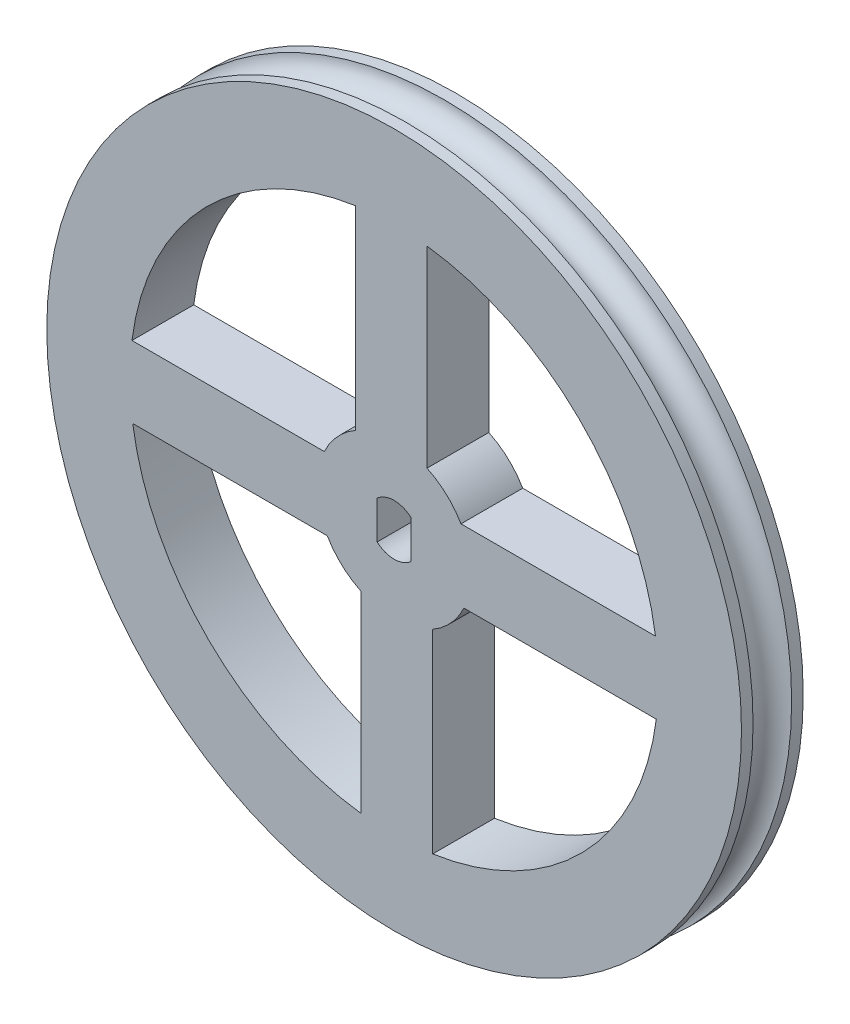
ISO-10303-21;
HEADER;
FILE_DESCRIPTION(('STEP AP214'),'2;1');
FILE_NAME('part.step','',(''),(''),'','','');
FILE_SCHEMA(('AUTOMOTIVE_DESIGN { 1 0 10303 214 1 1 1 1 }'));
ENDSEC;
DATA;
#1=APPLICATION_CONTEXT('core data for automotive mechanical design processes');
#2=APPLICATION_PROTOCOL_DEFINITION('international standard','automotive_design',2000,#1);
#3=PRODUCT_CONTEXT('',#1,'mechanical');
#4=PRODUCT('Part','Part','',(#3));
#5=PRODUCT_RELATED_PRODUCT_CATEGORY('part','',(#4));
#6=PRODUCT_DEFINITION_FORMATION('','',#4);
#7=PRODUCT_DEFINITION_CONTEXT('part definition',#1,'design');
#8=PRODUCT_DEFINITION('design','',#6,#7);
#9=PRODUCT_DEFINITION_SHAPE('','',#8);
#10=(LENGTH_UNIT() NAMED_UNIT(*) SI_UNIT(.MILLI.,.METRE.));
#11=(NAMED_UNIT(*) PLANE_ANGLE_UNIT() SI_UNIT($,.RADIAN.));
#12=(NAMED_UNIT(*) SI_UNIT($,.STERADIAN.) SOLID_ANGLE_UNIT());
#13=UNCERTAINTY_MEASURE_WITH_UNIT(LENGTH_MEASURE(1.E-05),#10,'distance_accuracy_value','');
#14=(GEOMETRIC_REPRESENTATION_CONTEXT(3) GLOBAL_UNCERTAINTY_ASSIGNED_CONTEXT((#13)) GLOBAL_UNIT_ASSIGNED_CONTEXT((#10,
#11,#12)) REPRESENTATION_CONTEXT('',''));
#15=CARTESIAN_POINT('',(0.,0.,0.));
#16=DIRECTION('',(0.,0.,1.));
#17=DIRECTION('',(1.,0.,0.));
#18=AXIS2_PLACEMENT_3D('',#15,#16,#17);
#19=CARTESIAN_POINT('',(0.,0.,10.16));
#20=DIRECTION('',(0.,0.,1.));
#21=DIRECTION('',(1.,0.,0.));
#22=AXIS2_PLACEMENT_3D('',#19,#20,#21);
#23=PLANE('',#22);
#24=CARTESIAN_POINT('',(0.,0.,10.16));
#25=DIRECTION('',(0.,0.,-1.));
#26=DIRECTION('',(-1.,0.,0.));
#27=AXIS2_PLACEMENT_3D('',#24,#25,#26);
#28=CIRCLE('',#27,4.191);
#29=CARTESIAN_POINT('',(-2.794,3.12378696456721,10.16));
#30=VERTEX_POINT('',#29);
#31=CARTESIAN_POINT('',(2.794,3.12378696456721,10.16));
#32=VERTEX_POINT('',#31);
#33=EDGE_CURVE('E179',#30,#32,#28,.T.);
#34=ORIENTED_EDGE('',*,*,#33,.T.);
#35=DIRECTION('',(0.,-1.,0.));
#36=VECTOR('',#35,1.);
#37=CARTESIAN_POINT('',(2.794,3.12378696456721,10.16));
#38=LINE('',#37,#36);
#39=CARTESIAN_POINT('',(2.794,-3.12378696456721,10.16));
#40=VERTEX_POINT('',#39);
#41=EDGE_CURVE('E188',#32,#40,#38,.T.);
#42=ORIENTED_EDGE('',*,*,#41,.T.);
#43=CARTESIAN_POINT('',(0.,0.,10.16));
#44=DIRECTION('',(0.,0.,-1.));
#45=DIRECTION('',(-1.,0.,0.));
#46=AXIS2_PLACEMENT_3D('',#43,#44,#45);
#47=CIRCLE('',#46,4.191);
#48=CARTESIAN_POINT('',(-2.794,-3.12378696456721,10.16));
#49=VERTEX_POINT('',#48);
#50=EDGE_CURVE('E55',#40,#49,#47,.T.);
#51=ORIENTED_EDGE('',*,*,#50,.T.);
#52=DIRECTION('',(0.,1.,0.));
#53=VECTOR('',#52,1.);
#54=CARTESIAN_POINT('',(-2.794,3.12378696456721,10.16));
#55=LINE('',#54,#53);
#56=EDGE_CURVE('E185',#49,#30,#55,.T.);
#57=ORIENTED_EDGE('',*,*,#56,.T.);
#58=EDGE_LOOP('',(#34,#42,#51,#57));
#59=FACE_BOUND('',#58,.T.);
#60=CARTESIAN_POINT('',(0.,0.,10.16));
#61=DIRECTION('',(0.,0.,-1.));
#62=DIRECTION('',(1.,0.,0.));
#63=AXIS2_PLACEMENT_3D('',#60,#61,#62);
#64=CIRCLE('',#63,43.4704101415283);
#65=CARTESIAN_POINT('',(5.41057402840431,43.1323804879333,10.16));
#66=VERTEX_POINT('',#65);
#67=CARTESIAN_POINT('',(43.0041167549421,6.35,10.16));
#68=VERTEX_POINT('',#67);
#69=EDGE_CURVE('E292',#66,#68,#64,.T.);
#70=ORIENTED_EDGE('',*,*,#69,.T.);
#71=DIRECTION('',(-1.,0.,0.));
#72=VECTOR('',#71,1.);
#73=CARTESIAN_POINT('',(43.0041167549421,6.35,10.16));
#74=LINE('',#73,#72);
#75=CARTESIAN_POINT('',(10.9985226280624,6.35,10.16));
#76=VERTEX_POINT('',#75);
#77=EDGE_CURVE('E304',#68,#76,#74,.T.);
#78=ORIENTED_EDGE('',*,*,#77,.T.);
#79=CARTESIAN_POINT('',(0.,0.,10.16));
#80=DIRECTION('',(0.,0.,1.));
#81=DIRECTION('',(1.,0.,0.));
#82=AXIS2_PLACEMENT_3D('',#79,#80,#81);
#83=CIRCLE('',#82,12.7);
#84=CARTESIAN_POINT('',(5.4105740284043,11.4898080350873,10.16));
#85=VERTEX_POINT('',#84);
#86=EDGE_CURVE('E301',#76,#85,#83,.T.);
#87=ORIENTED_EDGE('',*,*,#86,.T.);
#88=DIRECTION('',(0.,1.,0.));
#89=VECTOR('',#88,1.);
#90=CARTESIAN_POINT('',(5.4105740284043,11.4898080350873,10.16));
#91=LINE('',#90,#89);
#92=EDGE_CURVE('E282',#85,#66,#91,.T.);
#93=ORIENTED_EDGE('',*,*,#92,.T.);
#94=EDGE_LOOP('',(#70,#78,#87,#93));
#95=FACE_BOUND('',#94,.T.);
#96=CARTESIAN_POINT('',(0.,0.,10.16));
#97=DIRECTION('',(0.,0.,-1.));
#98=DIRECTION('',(1.,0.,0.));
#99=AXIS2_PLACEMENT_3D('',#96,#97,#98);
#100=CIRCLE('',#99,43.4704101415283);
#101=CARTESIAN_POINT('',(43.1323804879333,-5.41057402840431,10.16));
#102=VERTEX_POINT('',#101);
#103=CARTESIAN_POINT('',(6.35,-43.0041167549421,10.16));
#104=VERTEX_POINT('',#103);
#105=EDGE_CURVE('E262',#102,#104,#100,.T.);
#106=ORIENTED_EDGE('',*,*,#105,.T.);
#107=DIRECTION('',(0.,1.,0.));
#108=VECTOR('',#107,1.);
#109=CARTESIAN_POINT('',(6.35,-43.0041167549421,10.16));
#110=LINE('',#109,#108);
#111=CARTESIAN_POINT('',(6.35,-10.9985226280624,10.16));
#112=VERTEX_POINT('',#111);
#113=EDGE_CURVE('E274',#104,#112,#110,.T.);
#114=ORIENTED_EDGE('',*,*,#113,.T.);
#115=CARTESIAN_POINT('',(0.,0.,10.16));
#116=DIRECTION('',(0.,0.,1.));
#117=DIRECTION('',(1.,0.,0.));
#118=AXIS2_PLACEMENT_3D('',#115,#116,#117);
#119=CIRCLE('',#118,12.7);
#120=CARTESIAN_POINT('',(11.4898080350873,-5.4105740284043,10.16));
#121=VERTEX_POINT('',#120);
#122=EDGE_CURVE('E271',#112,#121,#119,.T.);
#123=ORIENTED_EDGE('',*,*,#122,.T.);
#124=DIRECTION('',(1.,0.,0.));
#125=VECTOR('',#124,1.);
#126=CARTESIAN_POINT('',(11.4898080350873,-5.4105740284043,10.16));
#127=LINE('',#126,#125);
#128=EDGE_CURVE('E250',#121,#102,#127,.T.);
#129=ORIENTED_EDGE('',*,*,#128,.T.);
#130=EDGE_LOOP('',(#106,#114,#123,#129));
#131=FACE_BOUND('',#130,.T.);
#132=CARTESIAN_POINT('',(0.,0.,10.16));
#133=DIRECTION('',(0.,0.,-1.));
#134=DIRECTION('',(1.,0.,0.));
#135=AXIS2_PLACEMENT_3D('',#132,#133,#134);
#136=CIRCLE('',#135,43.4704101415283);
#137=CARTESIAN_POINT('',(-5.41057402840431,-43.1323804879333,10.16));
#138=VERTEX_POINT('',#137);
#139=CARTESIAN_POINT('',(-43.0041167549421,-6.35,10.16));
#140=VERTEX_POINT('',#139);
#141=EDGE_CURVE('E228',#138,#140,#136,.T.);
#142=ORIENTED_EDGE('',*,*,#141,.T.);
#143=DIRECTION('',(1.,0.,0.));
#144=VECTOR('',#143,1.);
#145=CARTESIAN_POINT('',(-43.0041167549421,-6.35,10.16));
#146=LINE('',#145,#144);
#147=CARTESIAN_POINT('',(-10.9985226280624,-6.35,10.16));
#148=VERTEX_POINT('',#147);
#149=EDGE_CURVE('E242',#140,#148,#146,.T.);
#150=ORIENTED_EDGE('',*,*,#149,.T.);
#151=CARTESIAN_POINT('',(0.,0.,10.16));
#152=DIRECTION('',(0.,0.,1.));
#153=DIRECTION('',(1.,0.,0.));
#154=AXIS2_PLACEMENT_3D('',#151,#152,#153);
#155=CIRCLE('',#154,12.7);
#156=CARTESIAN_POINT('',(-5.4105740284043,-11.4898080350873,10.16));
#157=VERTEX_POINT('',#156);
#158=EDGE_CURVE('E239',#148,#157,#155,.T.);
#159=ORIENTED_EDGE('',*,*,#158,.T.);
#160=DIRECTION('',(0.,-1.,0.));
#161=VECTOR('',#160,1.);
#162=CARTESIAN_POINT('',(-5.4105740284043,-11.4898080350873,10.16));
#163=LINE('',#162,#161);
#164=EDGE_CURVE('E216',#157,#138,#163,.T.);
#165=ORIENTED_EDGE('',*,*,#164,.T.);
#166=EDGE_LOOP('',(#142,#150,#159,#165));
#167=FACE_BOUND('',#166,.T.);
#168=CARTESIAN_POINT('',(0.,0.,10.16));
#169=DIRECTION('',(0.,0.,-1.));
#170=DIRECTION('',(1.,0.,0.));
#171=AXIS2_PLACEMENT_3D('',#168,#169,#170);
#172=CIRCLE('',#171,43.4704101415283);
#173=CARTESIAN_POINT('',(-43.1323804879333,5.41057402840431,10.16));
#174=VERTEX_POINT('',#173);
#175=CARTESIAN_POINT('',(-6.35,43.0041167549421,10.16));
#176=VERTEX_POINT('',#175);
#177=EDGE_CURVE('E309',#174,#176,#172,.T.);
#178=ORIENTED_EDGE('',*,*,#177,.T.);
#179=DIRECTION('',(0.,-1.,0.));
#180=VECTOR('',#179,1.);
#181=CARTESIAN_POINT('',(-6.35,43.0041167549421,10.16));
#182=LINE('',#181,#180);
#183=CARTESIAN_POINT('',(-6.35,10.9985226280624,10.16));
#184=VERTEX_POINT('',#183);
#185=EDGE_CURVE('E312',#176,#184,#182,.T.);
#186=ORIENTED_EDGE('',*,*,#185,.T.);
#187=CARTESIAN_POINT('',(0.,0.,10.16));
#188=DIRECTION('',(0.,0.,1.));
#189=DIRECTION('',(1.,0.,0.));
#190=AXIS2_PLACEMENT_3D('',#187,#188,#189);
#191=CIRCLE('',#190,12.7);
#192=CARTESIAN_POINT('',(-11.4898080350873,5.4105740284043,10.16));
#193=VERTEX_POINT('',#192);
#194=EDGE_CURVE('E316',#184,#193,#191,.T.);
#195=ORIENTED_EDGE('',*,*,#194,.T.);
#196=DIRECTION('',(-1.,0.,0.));
#197=VECTOR('',#196,1.);
#198=CARTESIAN_POINT('',(-11.4898080350873,5.4105740284043,10.16));
#199=LINE('',#198,#197);
#200=EDGE_CURVE('E319',#193,#174,#199,.T.);
#201=ORIENTED_EDGE('',*,*,#200,.T.);
#202=EDGE_LOOP('',(#178,#186,#195,#201));
#203=FACE_BOUND('',#202,.T.);
#204=CARTESIAN_POINT('',(0.,0.,10.16));
#205=DIRECTION('',(0.,0.,-1.));
#206=DIRECTION('',(-1.,0.,0.));
#207=AXIS2_PLACEMENT_3D('',#204,#205,#206);
#208=CIRCLE('',#207,57.15);
#209=CARTESIAN_POINT('',(-57.15,0.,10.16));
#210=VERTEX_POINT('',#209);
#211=EDGE_CURVE('E11',#210,#210,#208,.T.);
#212=ORIENTED_EDGE('',*,*,#211,.F.);
#213=EDGE_LOOP('',(#212));
#214=FACE_BOUND('',#213,.T.);
#215=ADVANCED_FACE('F41',(#59,#95,#131,#167,#203,#214),#23,.T.);
#216=CARTESIAN_POINT('',(0.,0.,0.));
#217=DIRECTION('',(0.,0.,-1.));
#218=DIRECTION('',(-1.,0.,0.));
#219=AXIS2_PLACEMENT_3D('',#216,#217,#218);
#220=CYLINDRICAL_SURFACE('',#219,57.15);
#221=ORIENTED_EDGE('',*,*,#211,.T.);
#222=EDGE_LOOP('',(#221));
#223=FACE_BOUND('',#222,.T.);
#224=CARTESIAN_POINT('',(0.,0.,8.255));
#225=DIRECTION('',(0.,0.,-1.));
#226=DIRECTION('',(-1.,0.,0.));
#227=AXIS2_PLACEMENT_3D('',#224,#225,#226);
#228=CIRCLE('',#227,57.15);
#229=CARTESIAN_POINT('',(-57.15,0.,8.25500000000001));
#230=VERTEX_POINT('',#229);
#231=EDGE_CURVE('E48',#230,#230,#228,.T.);
#232=ORIENTED_EDGE('',*,*,#231,.F.);
#233=EDGE_LOOP('',(#232));
#234=FACE_BOUND('',#233,.T.);
#235=ADVANCED_FACE('F351',(#223,#234),#220,.T.);
#236=CARTESIAN_POINT('',(0.,0.,5.08000000000001));
#237=DIRECTION('',(0.,0.,-1.));
#238=DIRECTION('',(-1.,0.,0.));
#239=AXIS2_PLACEMENT_3D('',#236,#237,#238);
#240=TOROIDAL_SURFACE('',#239,57.15,3.175);
#241=ORIENTED_EDGE('',*,*,#231,.T.);
#242=EDGE_LOOP('',(#241));
#243=FACE_BOUND('',#242,.T.);
#244=CARTESIAN_POINT('',(0.,0.,1.90500000000001));
#245=DIRECTION('',(0.,0.,-1.));
#246=DIRECTION('',(-1.,0.,0.));
#247=AXIS2_PLACEMENT_3D('',#244,#245,#246);
#248=CIRCLE('',#247,57.15);
#249=CARTESIAN_POINT('',(-57.15,0.,1.90500000000001));
#250=VERTEX_POINT('',#249);
#251=EDGE_CURVE('E343',#250,#250,#248,.T.);
#252=ORIENTED_EDGE('',*,*,#251,.F.);
#253=EDGE_LOOP('',(#252));
#254=FACE_BOUND('',#253,.T.);
#255=ADVANCED_FACE('F348',(#243,#254),#240,.F.);
#256=CARTESIAN_POINT('',(0.,0.,0.));
#257=DIRECTION('',(0.,0.,-1.));
#258=DIRECTION('',(-1.,0.,0.));
#259=AXIS2_PLACEMENT_3D('',#256,#257,#258);
#260=CYLINDRICAL_SURFACE('',#259,57.15);
#261=ORIENTED_EDGE('',*,*,#251,.T.);
#262=EDGE_LOOP('',(#261));
#263=FACE_BOUND('',#262,.T.);
#264=CARTESIAN_POINT('',(0.,0.,0.));
#265=DIRECTION('',(0.,0.,-1.));
#266=DIRECTION('',(-1.,0.,0.));
#267=AXIS2_PLACEMENT_3D('',#264,#265,#266);
#268=CIRCLE('',#267,57.15);
#269=CARTESIAN_POINT('',(-57.15,0.,0.));
#270=VERTEX_POINT('',#269);
#271=EDGE_CURVE('E334',#270,#270,#268,.T.);
#272=ORIENTED_EDGE('',*,*,#271,.F.);
#273=EDGE_LOOP('',(#272));
#274=FACE_BOUND('',#273,.T.);
#275=ADVANCED_FACE('F358',(#263,#274),#260,.T.);
#276=CARTESIAN_POINT('',(0.,0.,0.));
#277=DIRECTION('',(0.,0.,-1.));
#278=DIRECTION('',(-1.,0.,0.));
#279=AXIS2_PLACEMENT_3D('',#276,#277,#278);
#280=PLANE('',#279);
#281=CARTESIAN_POINT('',(0.,0.,0.));
#282=DIRECTION('',(0.,0.,-1.));
#283=DIRECTION('',(-1.,0.,0.));
#284=AXIS2_PLACEMENT_3D('',#281,#282,#283);
#285=CIRCLE('',#284,4.191);
#286=CARTESIAN_POINT('',(-2.794,3.12378696456721,0.));
#287=VERTEX_POINT('',#286);
#288=CARTESIAN_POINT('',(2.794,3.12378696456721,0.));
#289=VERTEX_POINT('',#288);
#290=EDGE_CURVE('E63',#287,#289,#285,.T.);
#291=ORIENTED_EDGE('',*,*,#290,.F.);
#292=DIRECTION('',(0.,1.,0.));
#293=VECTOR('',#292,1.);
#294=CARTESIAN_POINT('',(-2.794,3.12378696456721,0.));
#295=LINE('',#294,#293);
#296=CARTESIAN_POINT('',(-2.794,-3.12378696456721,0.));
#297=VERTEX_POINT('',#296);
#298=EDGE_CURVE('E194',#297,#287,#295,.T.);
#299=ORIENTED_EDGE('',*,*,#298,.F.);
#300=CARTESIAN_POINT('',(0.,0.,0.));
#301=DIRECTION('',(0.,0.,-1.));
#302=DIRECTION('',(-1.,0.,0.));
#303=AXIS2_PLACEMENT_3D('',#300,#301,#302);
#304=CIRCLE('',#303,4.191);
#305=CARTESIAN_POINT('',(2.794,-3.12378696456721,0.));
#306=VERTEX_POINT('',#305);
#307=EDGE_CURVE('E197',#306,#297,#304,.T.);
#308=ORIENTED_EDGE('',*,*,#307,.F.);
#309=DIRECTION('',(0.,-1.,0.));
#310=VECTOR('',#309,1.);
#311=CARTESIAN_POINT('',(2.794,3.12378696456721,0.));
#312=LINE('',#311,#310);
#313=EDGE_CURVE('E203',#289,#306,#312,.T.);
#314=ORIENTED_EDGE('',*,*,#313,.F.);
#315=EDGE_LOOP('',(#291,#299,#308,#314));
#316=FACE_BOUND('',#315,.T.);
#317=CARTESIAN_POINT('',(0.,0.,0.));
#318=DIRECTION('',(0.,0.,-1.));
#319=DIRECTION('',(1.,0.,0.));
#320=AXIS2_PLACEMENT_3D('',#317,#318,#319);
#321=CIRCLE('',#320,43.4704101415283);
#322=CARTESIAN_POINT('',(5.41057402840431,43.1323804879333,0.));
#323=VERTEX_POINT('',#322);
#324=CARTESIAN_POINT('',(43.0041167549421,6.35,0.));
#325=VERTEX_POINT('',#324);
#326=EDGE_CURVE('E257',#323,#325,#321,.T.);
#327=ORIENTED_EDGE('',*,*,#326,.F.);
#328=DIRECTION('',(0.,1.,0.));
#329=VECTOR('',#328,1.);
#330=CARTESIAN_POINT('',(5.4105740284043,11.4898080350873,0.));
#331=LINE('',#330,#329);
#332=CARTESIAN_POINT('',(5.4105740284043,11.4898080350873,0.));
#333=VERTEX_POINT('',#332);
#334=EDGE_CURVE('E288',#333,#323,#331,.T.);
#335=ORIENTED_EDGE('',*,*,#334,.F.);
#336=CARTESIAN_POINT('',(0.,0.,0.));
#337=DIRECTION('',(0.,0.,1.));
#338=DIRECTION('',(1.,0.,0.));
#339=AXIS2_PLACEMENT_3D('',#336,#337,#338);
#340=CIRCLE('',#339,12.7);
#341=CARTESIAN_POINT('',(10.9985226280624,6.35,0.));
#342=VERTEX_POINT('',#341);
#343=EDGE_CURVE('E291',#342,#333,#340,.T.);
#344=ORIENTED_EDGE('',*,*,#343,.F.);
#345=DIRECTION('',(-1.,0.,0.));
#346=VECTOR('',#345,1.);
#347=CARTESIAN_POINT('',(43.0041167549421,6.35,0.));
#348=LINE('',#347,#346);
#349=EDGE_CURVE('E295',#325,#342,#348,.T.);
#350=ORIENTED_EDGE('',*,*,#349,.F.);
#351=EDGE_LOOP('',(#327,#335,#344,#350));
#352=FACE_BOUND('',#351,.T.);
#353=CARTESIAN_POINT('',(0.,0.,0.));
#354=DIRECTION('',(0.,0.,-1.));
#355=DIRECTION('',(1.,0.,0.));
#356=AXIS2_PLACEMENT_3D('',#353,#354,#355);
#357=CIRCLE('',#356,43.4704101415283);
#358=CARTESIAN_POINT('',(43.1323804879333,-5.41057402840431,0.));
#359=VERTEX_POINT('',#358);
#360=CARTESIAN_POINT('',(6.35,-43.0041167549421,0.));
#361=VERTEX_POINT('',#360);
#362=EDGE_CURVE('E223',#359,#361,#357,.T.);
#363=ORIENTED_EDGE('',*,*,#362,.F.);
#364=DIRECTION('',(1.,0.,0.));
#365=VECTOR('',#364,1.);
#366=CARTESIAN_POINT('',(11.4898080350873,-5.4105740284043,0.));
#367=LINE('',#366,#365);
#368=CARTESIAN_POINT('',(11.4898080350873,-5.4105740284043,0.));
#369=VERTEX_POINT('',#368);
#370=EDGE_CURVE('E258',#369,#359,#367,.T.);
#371=ORIENTED_EDGE('',*,*,#370,.F.);
#372=CARTESIAN_POINT('',(0.,0.,0.));
#373=DIRECTION('',(0.,0.,1.));
#374=DIRECTION('',(1.,0.,0.));
#375=AXIS2_PLACEMENT_3D('',#372,#373,#374);
#376=CIRCLE('',#375,12.7);
#377=CARTESIAN_POINT('',(6.34999999999999,-10.9985226280624,0.));
#378=VERTEX_POINT('',#377);
#379=EDGE_CURVE('E261',#378,#369,#376,.T.);
#380=ORIENTED_EDGE('',*,*,#379,.F.);
#381=DIRECTION('',(0.,1.,0.));
#382=VECTOR('',#381,1.);
#383=CARTESIAN_POINT('',(6.35,-43.0041167549421,0.));
#384=LINE('',#383,#382);
#385=EDGE_CURVE('E265',#361,#378,#384,.T.);
#386=ORIENTED_EDGE('',*,*,#385,.F.);
#387=EDGE_LOOP('',(#363,#371,#380,#386));
#388=FACE_BOUND('',#387,.T.);
#389=CARTESIAN_POINT('',(0.,0.,0.));
#390=DIRECTION('',(0.,0.,-1.));
#391=DIRECTION('',(1.,0.,0.));
#392=AXIS2_PLACEMENT_3D('',#389,#390,#391);
#393=CIRCLE('',#392,43.4704101415283);
#394=CARTESIAN_POINT('',(-5.41057402840431,-43.1323804879333,0.));
#395=VERTEX_POINT('',#394);
#396=CARTESIAN_POINT('',(-43.0041167549421,-6.35,0.));
#397=VERTEX_POINT('',#396);
#398=EDGE_CURVE('E234',#395,#397,#393,.T.);
#399=ORIENTED_EDGE('',*,*,#398,.F.);
#400=DIRECTION('',(0.,-1.,0.));
#401=VECTOR('',#400,1.);
#402=CARTESIAN_POINT('',(-5.4105740284043,-11.4898080350873,0.));
#403=LINE('',#402,#401);
#404=CARTESIAN_POINT('',(-5.4105740284043,-11.4898080350873,0.));
#405=VERTEX_POINT('',#404);
#406=EDGE_CURVE('E224',#405,#395,#403,.T.);
#407=ORIENTED_EDGE('',*,*,#406,.F.);
#408=CARTESIAN_POINT('',(0.,0.,0.));
#409=DIRECTION('',(0.,0.,1.));
#410=DIRECTION('',(1.,0.,0.));
#411=AXIS2_PLACEMENT_3D('',#408,#409,#410);
#412=CIRCLE('',#411,12.7);
#413=CARTESIAN_POINT('',(-10.9985226280624,-6.35,0.));
#414=VERTEX_POINT('',#413);
#415=EDGE_CURVE('E227',#414,#405,#412,.T.);
#416=ORIENTED_EDGE('',*,*,#415,.F.);
#417=DIRECTION('',(1.,0.,0.));
#418=VECTOR('',#417,1.);
#419=CARTESIAN_POINT('',(-43.0041167549421,-6.35,0.));
#420=LINE('',#419,#418);
#421=EDGE_CURVE('E231',#397,#414,#420,.T.);
#422=ORIENTED_EDGE('',*,*,#421,.F.);
#423=EDGE_LOOP('',(#399,#407,#416,#422));
#424=FACE_BOUND('',#423,.T.);
#425=CARTESIAN_POINT('',(0.,0.,0.));
#426=DIRECTION('',(0.,0.,-1.));
#427=DIRECTION('',(1.,0.,0.));
#428=AXIS2_PLACEMENT_3D('',#425,#426,#427);
#429=CIRCLE('',#428,43.4704101415283);
#430=CARTESIAN_POINT('',(-43.1323804879333,5.41057402840431,0.));
#431=VERTEX_POINT('',#430);
#432=CARTESIAN_POINT('',(-6.35,43.0041167549421,0.));
#433=VERTEX_POINT('',#432);
#434=EDGE_CURVE('E236',#431,#433,#429,.T.);
#435=ORIENTED_EDGE('',*,*,#434,.F.);
#436=DIRECTION('',(-1.,0.,0.));
#437=VECTOR('',#436,1.);
#438=CARTESIAN_POINT('',(-11.4898080350873,5.4105740284043,0.));
#439=LINE('',#438,#437);
#440=CARTESIAN_POINT('',(-11.4898080350873,5.4105740284043,0.));
#441=VERTEX_POINT('',#440);
#442=EDGE_CURVE('E313',#441,#431,#439,.T.);
#443=ORIENTED_EDGE('',*,*,#442,.F.);
#444=CARTESIAN_POINT('',(0.,0.,0.));
#445=DIRECTION('',(0.,0.,1.));
#446=DIRECTION('',(1.,0.,0.));
#447=AXIS2_PLACEMENT_3D('',#444,#445,#446);
#448=CIRCLE('',#447,12.7);
#449=CARTESIAN_POINT('',(-6.35,10.9985226280624,0.));
#450=VERTEX_POINT('',#449);
#451=EDGE_CURVE('E327',#450,#441,#448,.T.);
#452=ORIENTED_EDGE('',*,*,#451,.F.);
#453=DIRECTION('',(0.,-1.,0.));
#454=VECTOR('',#453,1.);
#455=CARTESIAN_POINT('',(-6.35,43.0041167549421,0.));
#456=LINE('',#455,#454);
#457=EDGE_CURVE('E324',#433,#450,#456,.T.);
#458=ORIENTED_EDGE('',*,*,#457,.F.);
#459=EDGE_LOOP('',(#435,#443,#452,#458));
#460=FACE_BOUND('',#459,.T.);
#461=ORIENTED_EDGE('',*,*,#271,.T.);
#462=EDGE_LOOP('',(#461));
#463=FACE_BOUND('',#462,.T.);
#464=ADVANCED_FACE('F363',(#316,#352,#388,#424,#460,#463),#280,.T.);
#465=CARTESIAN_POINT('',(0.,0.,10.16));
#466=DIRECTION('',(0.,0.,-1.));
#467=DIRECTION('',(-1.,0.,0.));
#468=AXIS2_PLACEMENT_3D('',#465,#466,#467);
#469=CYLINDRICAL_SURFACE('',#468,43.4704101415283);
#470=ORIENTED_EDGE('',*,*,#434,.T.);
#471=DIRECTION('',(0.,0.,-1.));
#472=VECTOR('',#471,1.);
#473=CARTESIAN_POINT('',(-6.35,43.0041167549421,10.16));
#474=LINE('',#473,#472);
#475=EDGE_CURVE('E322',#176,#433,#474,.T.);
#476=ORIENTED_EDGE('',*,*,#475,.F.);
#477=ORIENTED_EDGE('',*,*,#177,.F.);
#478=DIRECTION('',(0.,0.,-1.));
#479=VECTOR('',#478,1.);
#480=CARTESIAN_POINT('',(-43.1323804879333,5.41057402840431,10.16));
#481=LINE('',#480,#479);
#482=EDGE_CURVE('E332',#174,#431,#481,.T.);
#483=ORIENTED_EDGE('',*,*,#482,.T.);
#484=EDGE_LOOP('',(#470,#476,#477,#483));
#485=FACE_BOUND('',#484,.T.);
#486=ADVANCED_FACE('F367',(#485),#469,.F.);
#487=CARTESIAN_POINT('',(-11.4898080350873,5.4105740284043,10.16));
#488=DIRECTION('',(0.,-1.,0.));
#489=DIRECTION('',(1.,0.,0.));
#490=AXIS2_PLACEMENT_3D('',#487,#488,#489);
#491=PLANE('',#490);
#492=ORIENTED_EDGE('',*,*,#442,.T.);
#493=ORIENTED_EDGE('',*,*,#482,.F.);
#494=ORIENTED_EDGE('',*,*,#200,.F.);
#495=DIRECTION('',(0.,0.,-1.));
#496=VECTOR('',#495,1.);
#497=CARTESIAN_POINT('',(-11.4898080350873,5.4105740284043,10.16));
#498=LINE('',#497,#496);
#499=EDGE_CURVE('E335',#193,#441,#498,.T.);
#500=ORIENTED_EDGE('',*,*,#499,.T.);
#501=EDGE_LOOP('',(#492,#493,#494,#500));
#502=FACE_BOUND('',#501,.T.);
#503=ADVANCED_FACE('F371',(#502),#491,.F.);
#504=CARTESIAN_POINT('',(0.,0.,10.16));
#505=DIRECTION('',(0.,0.,-1.));
#506=DIRECTION('',(-1.,0.,0.));
#507=AXIS2_PLACEMENT_3D('',#504,#505,#506);
#508=CYLINDRICAL_SURFACE('',#507,12.7);
#509=ORIENTED_EDGE('',*,*,#451,.T.);
#510=ORIENTED_EDGE('',*,*,#499,.F.);
#511=ORIENTED_EDGE('',*,*,#194,.F.);
#512=DIRECTION('',(0.,0.,-1.));
#513=VECTOR('',#512,1.);
#514=CARTESIAN_POINT('',(-6.35,10.9985226280624,10.16));
#515=LINE('',#514,#513);
#516=EDGE_CURVE('E337',#184,#450,#515,.T.);
#517=ORIENTED_EDGE('',*,*,#516,.T.);
#518=EDGE_LOOP('',(#509,#510,#511,#517));
#519=FACE_BOUND('',#518,.T.);
#520=ADVANCED_FACE('F377',(#519),#508,.T.);
#521=CARTESIAN_POINT('',(-6.35,43.0041167549421,10.16));
#522=DIRECTION('',(1.,0.,0.));
#523=DIRECTION('',(0.,1.,0.));
#524=AXIS2_PLACEMENT_3D('',#521,#522,#523);
#525=PLANE('',#524);
#526=ORIENTED_EDGE('',*,*,#457,.T.);
#527=ORIENTED_EDGE('',*,*,#516,.F.);
#528=ORIENTED_EDGE('',*,*,#185,.F.);
#529=ORIENTED_EDGE('',*,*,#475,.T.);
#530=EDGE_LOOP('',(#526,#527,#528,#529));
#531=FACE_BOUND('',#530,.T.);
#532=ADVANCED_FACE('F373',(#531),#525,.F.);
#533=CARTESIAN_POINT('',(0.,0.,10.16));
#534=DIRECTION('',(0.,0.,-1.));
#535=DIRECTION('',(-1.,0.,0.));
#536=AXIS2_PLACEMENT_3D('',#533,#534,#535);
#537=CYLINDRICAL_SURFACE('',#536,43.4704101415283);
#538=ORIENTED_EDGE('',*,*,#398,.T.);
#539=DIRECTION('',(0.,0.,-1.));
#540=VECTOR('',#539,1.);
#541=CARTESIAN_POINT('',(-43.0041167549421,-6.35,10.16));
#542=LINE('',#541,#540);
#543=EDGE_CURVE('E213',#140,#397,#542,.T.);
#544=ORIENTED_EDGE('',*,*,#543,.F.);
#545=ORIENTED_EDGE('',*,*,#141,.F.);
#546=DIRECTION('',(0.,0.,-1.));
#547=VECTOR('',#546,1.);
#548=CARTESIAN_POINT('',(-5.41057402840431,-43.1323804879333,10.16));
#549=LINE('',#548,#547);
#550=EDGE_CURVE('E221',#138,#395,#549,.T.);
#551=ORIENTED_EDGE('',*,*,#550,.T.);
#552=EDGE_LOOP('',(#538,#544,#545,#551));
#553=FACE_BOUND('',#552,.T.);
#554=ADVANCED_FACE('F376',(#553),#537,.F.);
#555=CARTESIAN_POINT('',(-5.4105740284043,-11.4898080350873,10.16));
#556=DIRECTION('',(1.,0.,0.));
#557=DIRECTION('',(0.,1.,0.));
#558=AXIS2_PLACEMENT_3D('',#555,#556,#557);
#559=PLANE('',#558);
#560=ORIENTED_EDGE('',*,*,#406,.T.);
#561=ORIENTED_EDGE('',*,*,#550,.F.);
#562=ORIENTED_EDGE('',*,*,#164,.F.);
#563=DIRECTION('',(0.,0.,-1.));
#564=VECTOR('',#563,1.);
#565=CARTESIAN_POINT('',(-5.4105740284043,-11.4898080350873,10.16));
#566=LINE('',#565,#564);
#567=EDGE_CURVE('E219',#157,#405,#566,.T.);
#568=ORIENTED_EDGE('',*,*,#567,.T.);
#569=EDGE_LOOP('',(#560,#561,#562,#568));
#570=FACE_BOUND('',#569,.T.);
#571=ADVANCED_FACE('F418',(#570),#559,.F.);
#572=CARTESIAN_POINT('',(0.,0.,10.16));
#573=DIRECTION('',(0.,0.,-1.));
#574=DIRECTION('',(-1.,0.,0.));
#575=AXIS2_PLACEMENT_3D('',#572,#573,#574);
#576=CYLINDRICAL_SURFACE('',#575,12.7);
#577=ORIENTED_EDGE('',*,*,#415,.T.);
#578=ORIENTED_EDGE('',*,*,#567,.F.);
#579=ORIENTED_EDGE('',*,*,#158,.F.);
#580=DIRECTION('',(0.,0.,-1.));
#581=VECTOR('',#580,1.);
#582=CARTESIAN_POINT('',(-10.9985226280624,-6.35,10.16));
#583=LINE('',#582,#581);
#584=EDGE_CURVE('E217',#148,#414,#583,.T.);
#585=ORIENTED_EDGE('',*,*,#584,.T.);
#586=EDGE_LOOP('',(#577,#578,#579,#585));
#587=FACE_BOUND('',#586,.T.);
#588=ADVANCED_FACE('F421',(#587),#576,.T.);
#589=CARTESIAN_POINT('',(-43.0041167549421,-6.35,10.16));
#590=DIRECTION('',(0.,1.,0.));
#591=DIRECTION('',(-1.,0.,0.));
#592=AXIS2_PLACEMENT_3D('',#589,#590,#591);
#593=PLANE('',#592);
#594=ORIENTED_EDGE('',*,*,#421,.T.);
#595=ORIENTED_EDGE('',*,*,#584,.F.);
#596=ORIENTED_EDGE('',*,*,#149,.F.);
#597=ORIENTED_EDGE('',*,*,#543,.T.);
#598=EDGE_LOOP('',(#594,#595,#596,#597));
#599=FACE_BOUND('',#598,.T.);
#600=ADVANCED_FACE('F416',(#599),#593,.F.);
#601=CARTESIAN_POINT('',(0.,0.,10.16));
#602=DIRECTION('',(0.,0.,-1.));
#603=DIRECTION('',(-1.,0.,0.));
#604=AXIS2_PLACEMENT_3D('',#601,#602,#603);
#605=CYLINDRICAL_SURFACE('',#604,43.4704101415283);
#606=ORIENTED_EDGE('',*,*,#362,.T.);
#607=DIRECTION('',(0.,0.,-1.));
#608=VECTOR('',#607,1.);
#609=CARTESIAN_POINT('',(6.35,-43.0041167549421,10.16));
#610=LINE('',#609,#608);
#611=EDGE_CURVE('E247',#104,#361,#610,.T.);
#612=ORIENTED_EDGE('',*,*,#611,.F.);
#613=ORIENTED_EDGE('',*,*,#105,.F.);
#614=DIRECTION('',(0.,0.,-1.));
#615=VECTOR('',#614,1.);
#616=CARTESIAN_POINT('',(43.1323804879333,-5.41057402840431,10.16));
#617=LINE('',#616,#615);
#618=EDGE_CURVE('E255',#102,#359,#617,.T.);
#619=ORIENTED_EDGE('',*,*,#618,.T.);
#620=EDGE_LOOP('',(#606,#612,#613,#619));
#621=FACE_BOUND('',#620,.T.);
#622=ADVANCED_FACE('F406',(#621),#605,.F.);
#623=CARTESIAN_POINT('',(11.4898080350873,-5.4105740284043,10.16));
#624=DIRECTION('',(0.,1.,0.));
#625=DIRECTION('',(-1.,0.,0.));
#626=AXIS2_PLACEMENT_3D('',#623,#624,#625);
#627=PLANE('',#626);
#628=ORIENTED_EDGE('',*,*,#370,.T.);
#629=ORIENTED_EDGE('',*,*,#618,.F.);
#630=ORIENTED_EDGE('',*,*,#128,.F.);
#631=DIRECTION('',(0.,0.,-1.));
#632=VECTOR('',#631,1.);
#633=CARTESIAN_POINT('',(11.4898080350873,-5.4105740284043,10.16));
#634=LINE('',#633,#632);
#635=EDGE_CURVE('E253',#121,#369,#634,.T.);
#636=ORIENTED_EDGE('',*,*,#635,.T.);
#637=EDGE_LOOP('',(#628,#629,#630,#636));
#638=FACE_BOUND('',#637,.T.);
#639=ADVANCED_FACE('F402',(#638),#627,.F.);
#640=CARTESIAN_POINT('',(0.,0.,10.16));
#641=DIRECTION('',(0.,0.,-1.));
#642=DIRECTION('',(-1.,0.,0.));
#643=AXIS2_PLACEMENT_3D('',#640,#641,#642);
#644=CYLINDRICAL_SURFACE('',#643,12.7);
#645=ORIENTED_EDGE('',*,*,#379,.T.);
#646=ORIENTED_EDGE('',*,*,#635,.F.);
#647=ORIENTED_EDGE('',*,*,#122,.F.);
#648=DIRECTION('',(0.,0.,-1.));
#649=VECTOR('',#648,1.);
#650=CARTESIAN_POINT('',(6.34999999999999,-10.9985226280624,10.16));
#651=LINE('',#650,#649);
#652=EDGE_CURVE('E251',#112,#378,#651,.T.);
#653=ORIENTED_EDGE('',*,*,#652,.T.);
#654=EDGE_LOOP('',(#645,#646,#647,#653));
#655=FACE_BOUND('',#654,.T.);
#656=ADVANCED_FACE('F405',(#655),#644,.T.);
#657=CARTESIAN_POINT('',(6.35,-43.0041167549421,10.16));
#658=DIRECTION('',(-1.,0.,0.));
#659=DIRECTION('',(0.,0.,1.));
#660=AXIS2_PLACEMENT_3D('',#657,#658,#659);
#661=PLANE('',#660);
#662=ORIENTED_EDGE('',*,*,#385,.T.);
#663=ORIENTED_EDGE('',*,*,#652,.F.);
#664=ORIENTED_EDGE('',*,*,#113,.F.);
#665=ORIENTED_EDGE('',*,*,#611,.T.);
#666=EDGE_LOOP('',(#662,#663,#664,#665));
#667=FACE_BOUND('',#666,.T.);
#668=ADVANCED_FACE('F400',(#667),#661,.F.);
#669=CARTESIAN_POINT('',(0.,0.,10.16));
#670=DIRECTION('',(0.,0.,-1.));
#671=DIRECTION('',(-1.,0.,0.));
#672=AXIS2_PLACEMENT_3D('',#669,#670,#671);
#673=CYLINDRICAL_SURFACE('',#672,43.4704101415283);
#674=ORIENTED_EDGE('',*,*,#326,.T.);
#675=DIRECTION('',(0.,0.,-1.));
#676=VECTOR('',#675,1.);
#677=CARTESIAN_POINT('',(43.0041167549421,6.35,10.16));
#678=LINE('',#677,#676);
#679=EDGE_CURVE('E279',#68,#325,#678,.T.);
#680=ORIENTED_EDGE('',*,*,#679,.F.);
#681=ORIENTED_EDGE('',*,*,#69,.F.);
#682=DIRECTION('',(0.,0.,-1.));
#683=VECTOR('',#682,1.);
#684=CARTESIAN_POINT('',(5.41057402840431,43.1323804879333,10.16));
#685=LINE('',#684,#683);
#686=EDGE_CURVE('E209',#66,#323,#685,.T.);
#687=ORIENTED_EDGE('',*,*,#686,.T.);
#688=EDGE_LOOP('',(#674,#680,#681,#687));
#689=FACE_BOUND('',#688,.T.);
#690=ADVANCED_FACE('F389',(#689),#673,.F.);
#691=CARTESIAN_POINT('',(5.4105740284043,11.4898080350873,10.16));
#692=DIRECTION('',(-1.,0.,0.));
#693=DIRECTION('',(0.,-1.,0.));
#694=AXIS2_PLACEMENT_3D('',#691,#692,#693);
#695=PLANE('',#694);
#696=ORIENTED_EDGE('',*,*,#334,.T.);
#697=ORIENTED_EDGE('',*,*,#686,.F.);
#698=ORIENTED_EDGE('',*,*,#92,.F.);
#699=DIRECTION('',(0.,0.,-1.));
#700=VECTOR('',#699,1.);
#701=CARTESIAN_POINT('',(5.4105740284043,11.4898080350873,10.16));
#702=LINE('',#701,#700);
#703=EDGE_CURVE('E285',#85,#333,#702,.T.);
#704=ORIENTED_EDGE('',*,*,#703,.T.);
#705=EDGE_LOOP('',(#696,#697,#698,#704));
#706=FACE_BOUND('',#705,.T.);
#707=ADVANCED_FACE('F385',(#706),#695,.F.);
#708=CARTESIAN_POINT('',(0.,0.,10.16));
#709=DIRECTION('',(0.,0.,-1.));
#710=DIRECTION('',(-1.,0.,0.));
#711=AXIS2_PLACEMENT_3D('',#708,#709,#710);
#712=CYLINDRICAL_SURFACE('',#711,12.7);
#713=ORIENTED_EDGE('',*,*,#343,.T.);
#714=ORIENTED_EDGE('',*,*,#703,.F.);
#715=ORIENTED_EDGE('',*,*,#86,.F.);
#716=DIRECTION('',(0.,0.,-1.));
#717=VECTOR('',#716,1.);
#718=CARTESIAN_POINT('',(10.9985226280624,6.35,10.16));
#719=LINE('',#718,#717);
#720=EDGE_CURVE('E283',#76,#342,#719,.T.);
#721=ORIENTED_EDGE('',*,*,#720,.T.);
#722=EDGE_LOOP('',(#713,#714,#715,#721));
#723=FACE_BOUND('',#722,.T.);
#724=ADVANCED_FACE('F388',(#723),#712,.T.);
#725=CARTESIAN_POINT('',(43.0041167549421,6.35,10.16));
#726=DIRECTION('',(0.,-1.,0.));
#727=DIRECTION('',(1.,0.,0.));
#728=AXIS2_PLACEMENT_3D('',#725,#726,#727);
#729=PLANE('',#728);
#730=ORIENTED_EDGE('',*,*,#349,.T.);
#731=ORIENTED_EDGE('',*,*,#720,.F.);
#732=ORIENTED_EDGE('',*,*,#77,.F.);
#733=ORIENTED_EDGE('',*,*,#679,.T.);
#734=EDGE_LOOP('',(#730,#731,#732,#733));
#735=FACE_BOUND('',#734,.T.);
#736=ADVANCED_FACE('F393',(#735),#729,.F.);
#737=CARTESIAN_POINT('',(0.,0.,10.16));
#738=DIRECTION('',(0.,0.,-1.));
#739=DIRECTION('',(-1.,0.,0.));
#740=AXIS2_PLACEMENT_3D('',#737,#738,#739);
#741=CYLINDRICAL_SURFACE('',#740,4.191);
#742=ORIENTED_EDGE('',*,*,#290,.T.);
#743=DIRECTION('',(0.,0.,-1.));
#744=VECTOR('',#743,1.);
#745=CARTESIAN_POINT('',(2.794,3.12378696456721,10.16));
#746=LINE('',#745,#744);
#747=EDGE_CURVE('E175',#32,#289,#746,.T.);
#748=ORIENTED_EDGE('',*,*,#747,.F.);
#749=ORIENTED_EDGE('',*,*,#33,.F.);
#750=DIRECTION('',(0.,0.,-1.));
#751=VECTOR('',#750,1.);
#752=CARTESIAN_POINT('',(-2.794,3.12378696456721,10.16));
#753=LINE('',#752,#751);
#754=EDGE_CURVE('E207',#30,#287,#753,.T.);
#755=ORIENTED_EDGE('',*,*,#754,.T.);
#756=EDGE_LOOP('',(#742,#748,#749,#755));
#757=FACE_BOUND('',#756,.T.);
#758=ADVANCED_FACE('F177',(#757),#741,.F.);
#759=CARTESIAN_POINT('',(-2.794,3.12378696456721,10.16));
#760=DIRECTION('',(-1.,0.,0.));
#761=DIRECTION('',(0.,0.,1.));
#762=AXIS2_PLACEMENT_3D('',#759,#760,#761);
#763=PLANE('',#762);
#764=ORIENTED_EDGE('',*,*,#298,.T.);
#765=ORIENTED_EDGE('',*,*,#754,.F.);
#766=ORIENTED_EDGE('',*,*,#56,.F.);
#767=DIRECTION('',(0.,0.,-1.));
#768=VECTOR('',#767,1.);
#769=CARTESIAN_POINT('',(-2.794,-3.12378696456721,10.16));
#770=LINE('',#769,#768);
#771=EDGE_CURVE('E210',#49,#297,#770,.T.);
#772=ORIENTED_EDGE('',*,*,#771,.T.);
#773=EDGE_LOOP('',(#764,#765,#766,#772));
#774=FACE_BOUND('',#773,.T.);
#775=ADVANCED_FACE('F434',(#774),#763,.F.);
#776=CARTESIAN_POINT('',(0.,0.,10.16));
#777=DIRECTION('',(0.,0.,-1.));
#778=DIRECTION('',(-1.,0.,0.));
#779=AXIS2_PLACEMENT_3D('',#776,#777,#778);
#780=CYLINDRICAL_SURFACE('',#779,4.191);
#781=ORIENTED_EDGE('',*,*,#307,.T.);
#782=ORIENTED_EDGE('',*,*,#771,.F.);
#783=ORIENTED_EDGE('',*,*,#50,.F.);
#784=DIRECTION('',(0.,0.,-1.));
#785=VECTOR('',#784,1.);
#786=CARTESIAN_POINT('',(2.794,-3.12378696456721,10.16));
#787=LINE('',#786,#785);
#788=EDGE_CURVE('E184',#40,#306,#787,.T.);
#789=ORIENTED_EDGE('',*,*,#788,.T.);
#790=EDGE_LOOP('',(#781,#782,#783,#789));
#791=FACE_BOUND('',#790,.T.);
#792=ADVANCED_FACE('F437',(#791),#780,.F.);
#793=CARTESIAN_POINT('',(2.794,3.12378696456721,10.16));
#794=DIRECTION('',(1.,0.,0.));
#795=DIRECTION('',(0.,0.,-1.));
#796=AXIS2_PLACEMENT_3D('',#793,#794,#795);
#797=PLANE('',#796);
#798=ORIENTED_EDGE('',*,*,#313,.T.);
#799=ORIENTED_EDGE('',*,*,#788,.F.);
#800=ORIENTED_EDGE('',*,*,#41,.F.);
#801=ORIENTED_EDGE('',*,*,#747,.T.);
#802=EDGE_LOOP('',(#798,#799,#800,#801));
#803=FACE_BOUND('',#802,.T.);
#804=ADVANCED_FACE('F189',(#803),#797,.F.);
#805=CLOSED_SHELL('',(#215,#235,#255,#275,#464,#486,#503,#520,#532,#554,#571,#588,#600,#622,
#639,#656,#668,#690,#707,#724,#736,#758,#775,#792,#804));
#806=MANIFOLD_SOLID_BREP('B2',#805);
#807=ADVANCED_BREP_SHAPE_REPRESENTATION('',(#18,#806),#14);
#808=SHAPE_DEFINITION_REPRESENTATION(#9,#807);
ENDSEC;
END-ISO-10303-21;
